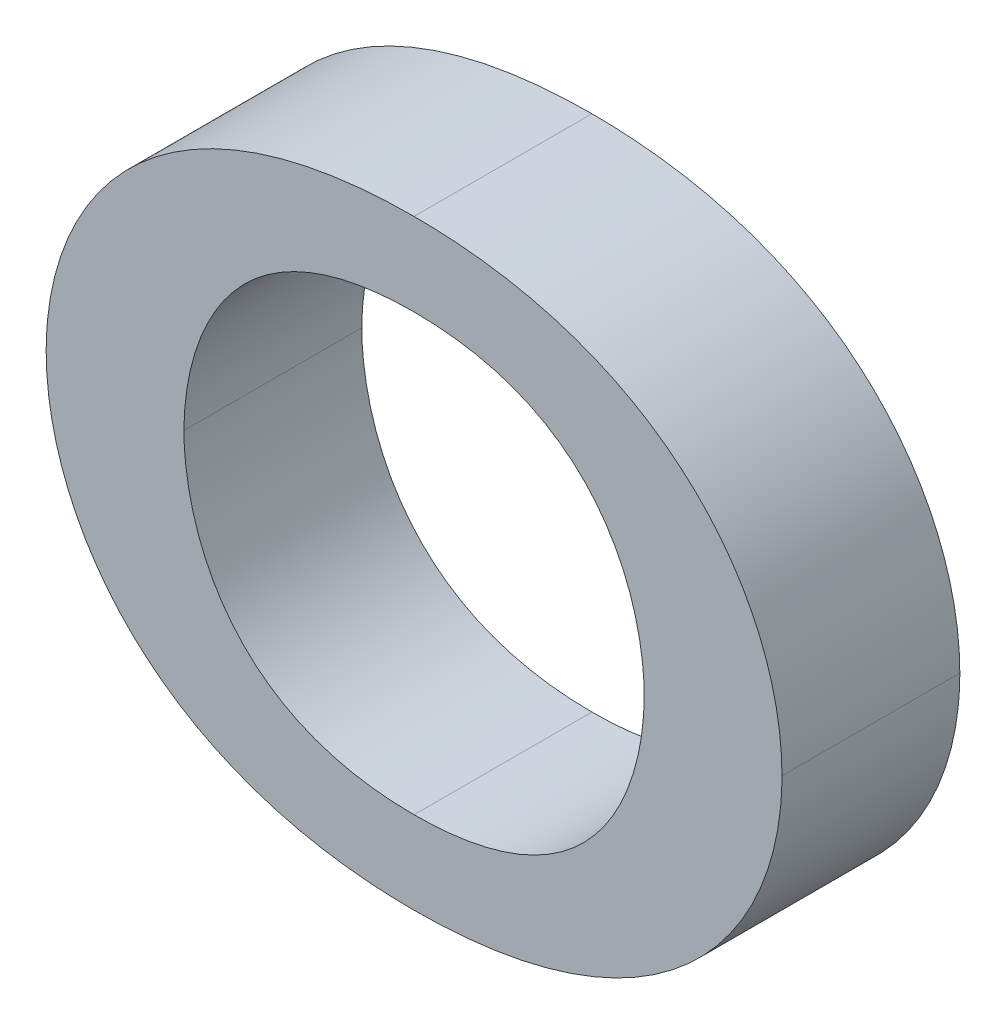
ISO-10303-21;
HEADER;
FILE_DESCRIPTION(('STEP AP214'),'2;1');
FILE_NAME('part.step','',(''),(''),'','','');
FILE_SCHEMA(('AUTOMOTIVE_DESIGN { 1 0 10303 214 1 1 1 1 }'));
ENDSEC;
DATA;
#1=APPLICATION_CONTEXT('core data for automotive mechanical design processes');
#2=APPLICATION_PROTOCOL_DEFINITION('international standard','automotive_design',2000,#1);
#3=PRODUCT_CONTEXT('',#1,'mechanical');
#4=PRODUCT('Part','Part','',(#3));
#5=PRODUCT_RELATED_PRODUCT_CATEGORY('part','',(#4));
#6=PRODUCT_DEFINITION_FORMATION('','',#4);
#7=PRODUCT_DEFINITION_CONTEXT('part definition',#1,'design');
#8=PRODUCT_DEFINITION('design','',#6,#7);
#9=PRODUCT_DEFINITION_SHAPE('','',#8);
#10=(LENGTH_UNIT() NAMED_UNIT(*) SI_UNIT(.MILLI.,.METRE.));
#11=(NAMED_UNIT(*) PLANE_ANGLE_UNIT() SI_UNIT($,.RADIAN.));
#12=(NAMED_UNIT(*) SI_UNIT($,.STERADIAN.) SOLID_ANGLE_UNIT());
#13=UNCERTAINTY_MEASURE_WITH_UNIT(LENGTH_MEASURE(1.E-05),#10,'distance_accuracy_value','');
#14=(GEOMETRIC_REPRESENTATION_CONTEXT(3) GLOBAL_UNCERTAINTY_ASSIGNED_CONTEXT((#13)) GLOBAL_UNIT_ASSIGNED_CONTEXT((#10,
#11,#12)) REPRESENTATION_CONTEXT('',''));
#15=CARTESIAN_POINT('',(0.,0.,0.));
#16=DIRECTION('',(0.,0.,1.));
#17=DIRECTION('',(1.,0.,0.));
#18=AXIS2_PLACEMENT_3D('',#15,#16,#17);
#19=CARTESIAN_POINT('',(-11.242747824746,-2.367797861412,-5.499));
#20=CARTESIAN_POINT('',(-11.242747824746,-2.367797861412,-6.501));
#21=CARTESIAN_POINT('',(-12.315409580301,-2.367797861412,-5.499));
#22=CARTESIAN_POINT('',(-12.315409580301,-2.367797861412,-6.501));
#23=CARTESIAN_POINT('',(-12.536649224746,-1.572100528079,-5.499));
#24=CARTESIAN_POINT('',(-12.536649224746,-1.572100528079,-6.501));
#25=CARTESIAN_POINT('',(-12.536649224746,-1.143704128079,-5.499));
#26=CARTESIAN_POINT('',(-12.536649224746,-1.143704128079,-6.501));
#27=(BOUNDED_SURFACE() B_SPLINE_SURFACE(3,1,((#19,#20),(#21,#22),(#23,#24),(#25,#26)),
.UNSPECIFIED.,.F.,.F.,.F.) B_SPLINE_SURFACE_WITH_KNOTS((4,4),(2,2),(0.,1.),(-1.001,0.001),
.UNSPECIFIED.) GEOMETRIC_REPRESENTATION_ITEM() RATIONAL_B_SPLINE_SURFACE(((1.,1.),(1.,1.),(1.,
1.),(1.,1.))) REPRESENTATION_ITEM('') SURFACE());
#28=DIRECTION('',(0.,0.,1.));
#29=VECTOR('',#28,1.);
#30=CARTESIAN_POINT('',(-11.242747824746,-2.367797861412,-6.5));
#31=LINE('',#30,#29);
#32=CARTESIAN_POINT('',(-11.242747824746,-2.367797861412,-6.5));
#33=VERTEX_POINT('',#32);
#34=CARTESIAN_POINT('',(-11.242747824746,-2.367797861412,-5.5));
#35=VERTEX_POINT('',#34);
#36=EDGE_CURVE('E118',#33,#35,#31,.T.);
#37=CARTESIAN_POINT('',(-11.242747824746,-2.367797861412,-6.5));
#38=CARTESIAN_POINT('',(-12.315409580301,-2.367797861412,-6.5));
#39=CARTESIAN_POINT('',(-12.536649224746,-1.572100528079,-6.5));
#40=CARTESIAN_POINT('',(-12.536649224746,-1.143704128079,-6.5));
#41=(BOUNDED_CURVE() B_SPLINE_CURVE(3,(#37,#38,#39,#40),.UNSPECIFIED.,.F.,
.F.) B_SPLINE_CURVE_WITH_KNOTS((4,4),(0.,1.),
.UNSPECIFIED.) CURVE() GEOMETRIC_REPRESENTATION_ITEM() RATIONAL_B_SPLINE_CURVE((1.,1.,1.,1.)) REPRESENTATION_ITEM(''));
#42=CARTESIAN_POINT('',(-12.536649224746,-1.143704128079,-6.5));
#43=VERTEX_POINT('',#42);
#44=EDGE_CURVE('E139',#33,#43,#41,.T.);
#45=DIRECTION('',(0.,0.,1.));
#46=VECTOR('',#45,1.);
#47=CARTESIAN_POINT('',(-12.536649224746,-1.143704128079,-6.5));
#48=LINE('',#47,#46);
#49=CARTESIAN_POINT('',(-12.536649224746,-1.143704128079,-5.5));
#50=VERTEX_POINT('',#49);
#51=EDGE_CURVE('E11',#43,#50,#48,.T.);
#52=CARTESIAN_POINT('',(-11.242747824746,-2.367797861412,-5.5));
#53=CARTESIAN_POINT('',(-12.315409580301,-2.367797861412,-5.5));
#54=CARTESIAN_POINT('',(-12.536649224746,-1.572100528079,-5.5));
#55=CARTESIAN_POINT('',(-12.536649224746,-1.143704128079,-5.5));
#56=(BOUNDED_CURVE() B_SPLINE_CURVE(3,(#52,#53,#54,#55),.UNSPECIFIED.,.F.,
.F.) B_SPLINE_CURVE_WITH_KNOTS((4,4),(0.,1.),
.UNSPECIFIED.) CURVE() GEOMETRIC_REPRESENTATION_ITEM() RATIONAL_B_SPLINE_CURVE((1.,1.,1.,1.)) REPRESENTATION_ITEM(''));
#57=EDGE_CURVE('E132',#35,#50,#56,.T.);
#58=ORIENTED_EDGE('',*,*,#36,.F.);
#59=ORIENTED_EDGE('',*,*,#44,.T.);
#60=ORIENTED_EDGE('',*,*,#51,.T.);
#61=ORIENTED_EDGE('',*,*,#57,.F.);
#62=EDGE_LOOP('',(#58,#59,#60,#61));
#63=FACE_BOUND('',#62,.T.);
#64=ADVANCED_FACE('F16',(#63),#27,.F.);
#65=CARTESIAN_POINT('',(-12.536649224746,-1.143704128079,-5.499));
#66=CARTESIAN_POINT('',(-12.536649224746,-1.143704128079,-6.501));
#67=CARTESIAN_POINT('',(-12.536649224746,-0.715369816968,-5.499));
#68=CARTESIAN_POINT('',(-12.536649224746,-0.715369816968,-6.501));
#69=CARTESIAN_POINT('',(-12.315409580301,0.0803275163660002,-5.499));
#70=CARTESIAN_POINT('',(-12.315409580301,0.0803275163660002,-6.501));
#71=CARTESIAN_POINT('',(-11.242747824746,0.0803275163660002,-5.499));
#72=CARTESIAN_POINT('',(-11.242747824746,0.0803275163660002,-6.501));
#73=(BOUNDED_SURFACE() B_SPLINE_SURFACE(3,1,((#65,#66),(#67,#68),(#69,#70),(#71,#72)),
.UNSPECIFIED.,.F.,.F.,.F.) B_SPLINE_SURFACE_WITH_KNOTS((4,4),(2,2),(0.,1.),(-1.001,0.001),
.UNSPECIFIED.) GEOMETRIC_REPRESENTATION_ITEM() RATIONAL_B_SPLINE_SURFACE(((1.,1.),(1.,1.),(1.,
1.),(1.,1.))) REPRESENTATION_ITEM('') SURFACE());
#74=CARTESIAN_POINT('',(-12.536649224746,-1.143704128079,-6.5));
#75=CARTESIAN_POINT('',(-12.536649224746,-0.715369816968,-6.5));
#76=CARTESIAN_POINT('',(-12.315409580301,0.0803275163660002,-6.5));
#77=CARTESIAN_POINT('',(-11.242747824746,0.0803275163660002,-6.5));
#78=(BOUNDED_CURVE() B_SPLINE_CURVE(3,(#74,#75,#76,#77),.UNSPECIFIED.,.F.,
.F.) B_SPLINE_CURVE_WITH_KNOTS((4,4),(0.,1.),
.UNSPECIFIED.) CURVE() GEOMETRIC_REPRESENTATION_ITEM() RATIONAL_B_SPLINE_CURVE((1.,1.,1.,1.)) REPRESENTATION_ITEM(''));
#79=CARTESIAN_POINT('',(-11.242747824746,0.0803275163660002,-6.5));
#80=VERTEX_POINT('',#79);
#81=EDGE_CURVE('E200',#43,#80,#78,.T.);
#82=DIRECTION('',(0.,0.,1.));
#83=VECTOR('',#82,1.);
#84=CARTESIAN_POINT('',(-11.242747824746,0.0803275163660002,-6.5));
#85=LINE('',#84,#83);
#86=CARTESIAN_POINT('',(-11.242747824746,0.0803275163660002,-5.5));
#87=VERTEX_POINT('',#86);
#88=EDGE_CURVE('E31',#80,#87,#85,.T.);
#89=CARTESIAN_POINT('',(-12.536649224746,-1.143704128079,-5.5));
#90=CARTESIAN_POINT('',(-12.536649224746,-0.715369816968,-5.5));
#91=CARTESIAN_POINT('',(-12.315409580301,0.0803275163660002,-5.5));
#92=CARTESIAN_POINT('',(-11.242747824746,0.0803275163660002,-5.5));
#93=(BOUNDED_CURVE() B_SPLINE_CURVE(3,(#89,#90,#91,#92),.UNSPECIFIED.,.F.,
.F.) B_SPLINE_CURVE_WITH_KNOTS((4,4),(0.,1.),
.UNSPECIFIED.) CURVE() GEOMETRIC_REPRESENTATION_ITEM() RATIONAL_B_SPLINE_CURVE((1.,1.,1.,1.)) REPRESENTATION_ITEM(''));
#94=EDGE_CURVE('E125',#50,#87,#93,.T.);
#95=ORIENTED_EDGE('',*,*,#51,.F.);
#96=ORIENTED_EDGE('',*,*,#81,.T.);
#97=ORIENTED_EDGE('',*,*,#88,.T.);
#98=ORIENTED_EDGE('',*,*,#94,.F.);
#99=EDGE_LOOP('',(#95,#96,#97,#98));
#100=FACE_BOUND('',#99,.T.);
#101=ADVANCED_FACE('F285',(#100),#73,.F.);
#102=CARTESIAN_POINT('',(-11.242747824746,0.0803275163660002,-5.499));
#103=CARTESIAN_POINT('',(-11.242747824746,0.0803275163660002,-6.501));
#104=CARTESIAN_POINT('',(-10.170105824746,0.0803275163660002,-5.499));
#105=CARTESIAN_POINT('',(-10.170105824746,0.0803275163660002,-6.501));
#106=CARTESIAN_POINT('',(-9.948606535857,-0.715369816968,-5.499));
#107=CARTESIAN_POINT('',(-9.948606535857,-0.715369816968,-6.501));
#108=CARTESIAN_POINT('',(-9.948606535857,-1.143704128079,-5.499));
#109=CARTESIAN_POINT('',(-9.948606535857,-1.143704128079,-6.501));
#110=(BOUNDED_SURFACE() B_SPLINE_SURFACE(3,1,((#102,#103),(#104,#105),(#106,#107),(#108,#109)),
.UNSPECIFIED.,.F.,.F.,.F.) B_SPLINE_SURFACE_WITH_KNOTS((4,4),(2,2),(0.,1.),(-1.001,0.001),
.UNSPECIFIED.) GEOMETRIC_REPRESENTATION_ITEM() RATIONAL_B_SPLINE_SURFACE(((1.,1.),(1.,1.),(1.,
1.),(1.,1.))) REPRESENTATION_ITEM('') SURFACE());
#111=CARTESIAN_POINT('',(-11.242747824746,0.0803275163660002,-6.5));
#112=CARTESIAN_POINT('',(-10.170105824746,0.0803275163660002,-6.5));
#113=CARTESIAN_POINT('',(-9.948606535857,-0.715369816968,-6.5));
#114=CARTESIAN_POINT('',(-9.948606535857,-1.143704128079,-6.5));
#115=(BOUNDED_CURVE() B_SPLINE_CURVE(3,(#111,#112,#113,#114),.UNSPECIFIED.,.F.,
.F.) B_SPLINE_CURVE_WITH_KNOTS((4,4),(0.,1.),
.UNSPECIFIED.) CURVE() GEOMETRIC_REPRESENTATION_ITEM() RATIONAL_B_SPLINE_CURVE((1.,1.,1.,1.)) REPRESENTATION_ITEM(''));
#116=CARTESIAN_POINT('',(-9.948606535857,-1.143704128079,-6.5));
#117=VERTEX_POINT('',#116);
#118=EDGE_CURVE('E112',#80,#117,#115,.T.);
#119=DIRECTION('',(0.,0.,1.));
#120=VECTOR('',#119,1.);
#121=CARTESIAN_POINT('',(-9.948606535857,-1.143704128079,-6.5));
#122=LINE('',#121,#120);
#123=CARTESIAN_POINT('',(-9.948606535857,-1.143704128079,-5.5));
#124=VERTEX_POINT('',#123);
#125=EDGE_CURVE('E106',#117,#124,#122,.T.);
#126=CARTESIAN_POINT('',(-11.242747824746,0.0803275163660002,-5.5));
#127=CARTESIAN_POINT('',(-10.170105824746,0.0803275163660002,-5.5));
#128=CARTESIAN_POINT('',(-9.948606535857,-0.715369816968,-5.5));
#129=CARTESIAN_POINT('',(-9.948606535857,-1.143704128079,-5.5));
#130=(BOUNDED_CURVE() B_SPLINE_CURVE(3,(#126,#127,#128,#129),.UNSPECIFIED.,.F.,
.F.) B_SPLINE_CURVE_WITH_KNOTS((4,4),(0.,1.),
.UNSPECIFIED.) CURVE() GEOMETRIC_REPRESENTATION_ITEM() RATIONAL_B_SPLINE_CURVE((1.,1.,1.,1.)) REPRESENTATION_ITEM(''));
#131=EDGE_CURVE('E109',#87,#124,#130,.T.);
#132=ORIENTED_EDGE('',*,*,#88,.F.);
#133=ORIENTED_EDGE('',*,*,#118,.T.);
#134=ORIENTED_EDGE('',*,*,#125,.T.);
#135=ORIENTED_EDGE('',*,*,#131,.F.);
#136=EDGE_LOOP('',(#132,#133,#134,#135));
#137=FACE_BOUND('',#136,.T.);
#138=ADVANCED_FACE('F108',(#137),#110,.F.);
#139=CARTESIAN_POINT('',(-9.948606535857,-1.143704128079,-5.499));
#140=CARTESIAN_POINT('',(-9.948606535857,-1.143704128079,-6.501));
#141=CARTESIAN_POINT('',(-9.948606535857,-1.572100528079,-5.499));
#142=CARTESIAN_POINT('',(-9.948606535857,-1.572100528079,-6.501));
#143=CARTESIAN_POINT('',(-10.170103002523,-2.367797861412,-5.499));
#144=CARTESIAN_POINT('',(-10.170103002523,-2.367797861412,-6.501));
#145=CARTESIAN_POINT('',(-11.242747824746,-2.367797861412,-5.499));
#146=CARTESIAN_POINT('',(-11.242747824746,-2.367797861412,-6.501));
#147=(BOUNDED_SURFACE() B_SPLINE_SURFACE(3,1,((#139,#140),(#141,#142),(#143,#144),(#145,#146)),
.UNSPECIFIED.,.F.,.F.,.F.) B_SPLINE_SURFACE_WITH_KNOTS((4,4),(2,2),(0.,1.),(-1.001,0.001),
.UNSPECIFIED.) GEOMETRIC_REPRESENTATION_ITEM() RATIONAL_B_SPLINE_SURFACE(((1.,1.),(1.,1.),(1.,
1.),(1.,1.))) REPRESENTATION_ITEM('') SURFACE());
#148=CARTESIAN_POINT('',(-9.948606535857,-1.143704128079,-6.5));
#149=CARTESIAN_POINT('',(-9.948606535857,-1.572100528079,-6.5));
#150=CARTESIAN_POINT('',(-10.170103002523,-2.367797861412,-6.5));
#151=CARTESIAN_POINT('',(-11.242747824746,-2.367797861412,-6.5));
#152=(BOUNDED_CURVE() B_SPLINE_CURVE(3,(#148,#149,#150,#151),.UNSPECIFIED.,.F.,
.F.) B_SPLINE_CURVE_WITH_KNOTS((4,4),(0.,1.),
.UNSPECIFIED.) CURVE() GEOMETRIC_REPRESENTATION_ITEM() RATIONAL_B_SPLINE_CURVE((1.,1.,1.,1.)) REPRESENTATION_ITEM(''));
#153=EDGE_CURVE('E182',#117,#33,#152,.T.);
#154=CARTESIAN_POINT('',(-9.948606535857,-1.143704128079,-5.5));
#155=CARTESIAN_POINT('',(-9.948606535857,-1.572100528079,-5.5));
#156=CARTESIAN_POINT('',(-10.170103002523,-2.367797861412,-5.5));
#157=CARTESIAN_POINT('',(-11.242747824746,-2.367797861412,-5.5));
#158=(BOUNDED_CURVE() B_SPLINE_CURVE(3,(#154,#155,#156,#157),.UNSPECIFIED.,.F.,
.F.) B_SPLINE_CURVE_WITH_KNOTS((4,4),(0.,1.),
.UNSPECIFIED.) CURVE() GEOMETRIC_REPRESENTATION_ITEM() RATIONAL_B_SPLINE_CURVE((1.,1.,1.,1.)) REPRESENTATION_ITEM(''));
#159=EDGE_CURVE('E124',#124,#35,#158,.T.);
#160=ORIENTED_EDGE('',*,*,#125,.F.);
#161=ORIENTED_EDGE('',*,*,#153,.T.);
#162=ORIENTED_EDGE('',*,*,#36,.T.);
#163=ORIENTED_EDGE('',*,*,#159,.F.);
#164=EDGE_LOOP('',(#160,#161,#162,#163));
#165=FACE_BOUND('',#164,.T.);
#166=ADVANCED_FACE('F128',(#165),#147,.F.);
#167=CARTESIAN_POINT('',(-11.242747824746,-2.832880328079,-5.499));
#168=CARTESIAN_POINT('',(-11.242747824746,-2.832880328079,-6.501));
#169=CARTESIAN_POINT('',(-9.821081602523,-2.832880328079,-5.499));
#170=CARTESIAN_POINT('',(-9.821081602523,-2.832880328079,-6.501));
#171=CARTESIAN_POINT('',(-9.174070224746,-1.969881461412,-5.499));
#172=CARTESIAN_POINT('',(-9.174070224746,-1.969881461412,-6.501));
#173=CARTESIAN_POINT('',(-9.174070224746,-1.143704128079,-5.499));
#174=CARTESIAN_POINT('',(-9.174070224746,-1.143704128079,-6.501));
#175=(BOUNDED_SURFACE() B_SPLINE_SURFACE(3,1,((#167,#168),(#169,#170),(#171,#172),(#173,#174)),
.UNSPECIFIED.,.F.,.F.,.F.) B_SPLINE_SURFACE_WITH_KNOTS((4,4),(2,2),(0.,1.),(-1.001,0.001),
.UNSPECIFIED.) GEOMETRIC_REPRESENTATION_ITEM() RATIONAL_B_SPLINE_SURFACE(((1.,1.),(1.,1.),(1.,
1.),(1.,1.))) REPRESENTATION_ITEM('') SURFACE());
#176=DIRECTION('',(0.,0.,1.));
#177=VECTOR('',#176,1.);
#178=CARTESIAN_POINT('',(-11.242747824746,-2.832880328079,-6.5));
#179=LINE('',#178,#177);
#180=CARTESIAN_POINT('',(-11.242747824746,-2.832880328079,-6.5));
#181=VERTEX_POINT('',#180);
#182=CARTESIAN_POINT('',(-11.242747824746,-2.832880328079,-5.5));
#183=VERTEX_POINT('',#182);
#184=EDGE_CURVE('E174',#181,#183,#179,.T.);
#185=CARTESIAN_POINT('',(-11.242747824746,-2.832880328079,-6.5));
#186=CARTESIAN_POINT('',(-9.821081602523,-2.832880328079,-6.5));
#187=CARTESIAN_POINT('',(-9.174070224746,-1.969881461412,-6.5));
#188=CARTESIAN_POINT('',(-9.174070224746,-1.143704128079,-6.5));
#189=(BOUNDED_CURVE() B_SPLINE_CURVE(3,(#185,#186,#187,#188),.UNSPECIFIED.,.F.,
.F.) B_SPLINE_CURVE_WITH_KNOTS((4,4),(0.,1.),
.UNSPECIFIED.) CURVE() GEOMETRIC_REPRESENTATION_ITEM() RATIONAL_B_SPLINE_CURVE((1.,1.,1.,1.)) REPRESENTATION_ITEM(''));
#190=CARTESIAN_POINT('',(-9.174070224746,-1.143704128079,-6.5));
#191=VERTEX_POINT('',#190);
#192=EDGE_CURVE('E22',#181,#191,#189,.T.);
#193=DIRECTION('',(0.,0.,1.));
#194=VECTOR('',#193,1.);
#195=CARTESIAN_POINT('',(-9.174070224746,-1.143704128079,-6.5));
#196=LINE('',#195,#194);
#197=CARTESIAN_POINT('',(-9.174070224746,-1.143704128079,-5.5));
#198=VERTEX_POINT('',#197);
#199=EDGE_CURVE('E172',#191,#198,#196,.T.);
#200=CARTESIAN_POINT('',(-11.242747824746,-2.832880328079,-5.5));
#201=CARTESIAN_POINT('',(-9.821081602523,-2.832880328079,-5.5));
#202=CARTESIAN_POINT('',(-9.174070224746,-1.969881461412,-5.5));
#203=CARTESIAN_POINT('',(-9.174070224746,-1.143704128079,-5.5));
#204=(BOUNDED_CURVE() B_SPLINE_CURVE(3,(#200,#201,#202,#203),.UNSPECIFIED.,.F.,
.F.) B_SPLINE_CURVE_WITH_KNOTS((4,4),(0.,1.),
.UNSPECIFIED.) CURVE() GEOMETRIC_REPRESENTATION_ITEM() RATIONAL_B_SPLINE_CURVE((1.,1.,1.,1.)) REPRESENTATION_ITEM(''));
#205=EDGE_CURVE('E79',#183,#198,#204,.T.);
#206=ORIENTED_EDGE('',*,*,#184,.F.);
#207=ORIENTED_EDGE('',*,*,#192,.T.);
#208=ORIENTED_EDGE('',*,*,#199,.T.);
#209=ORIENTED_EDGE('',*,*,#205,.F.);
#210=EDGE_LOOP('',(#206,#207,#208,#209));
#211=FACE_BOUND('',#210,.T.);
#212=ADVANCED_FACE('F326',(#211),#175,.F.);
#213=CARTESIAN_POINT('',(-11.242657912226,-1.14372778366,-5.5));
#214=DIRECTION('',(0.,0.,1.));
#215=DIRECTION('',(0.,-1.,0.));
#216=AXIS2_PLACEMENT_3D('',#213,#214,#215);
#217=PLANE('',#216);
#218=ORIENTED_EDGE('',*,*,#159,.T.);
#219=ORIENTED_EDGE('',*,*,#57,.T.);
#220=ORIENTED_EDGE('',*,*,#94,.T.);
#221=ORIENTED_EDGE('',*,*,#131,.T.);
#222=EDGE_LOOP('',(#218,#219,#220,#221));
#223=FACE_BOUND('',#222,.T.);
#224=CARTESIAN_POINT('',(-11.242747824746,0.545409983032,-5.5));
#225=CARTESIAN_POINT('',(-12.664430980301,0.545409983032,-5.5));
#226=CARTESIAN_POINT('',(-13.311171424746,-0.317453416968,-5.5));
#227=CARTESIAN_POINT('',(-13.311171424746,-1.143704128079,-5.5));
#228=(BOUNDED_CURVE() B_SPLINE_CURVE(3,(#224,#225,#226,#227),.UNSPECIFIED.,.F.,
.F.) B_SPLINE_CURVE_WITH_KNOTS((4,4),(0.,1.),
.UNSPECIFIED.) CURVE() GEOMETRIC_REPRESENTATION_ITEM() RATIONAL_B_SPLINE_CURVE((1.,1.,1.,1.)) REPRESENTATION_ITEM(''));
#229=CARTESIAN_POINT('',(-11.242747824746,0.545409983032,-5.5));
#230=VERTEX_POINT('',#229);
#231=CARTESIAN_POINT('',(-13.311171424746,-1.143704128079,-5.5));
#232=VERTEX_POINT('',#231);
#233=EDGE_CURVE('E163',#230,#232,#228,.T.);
#234=ORIENTED_EDGE('',*,*,#233,.T.);
#235=CARTESIAN_POINT('',(-13.311171424746,-1.143704128079,-5.5));
#236=CARTESIAN_POINT('',(-13.311171424746,-1.96987863919,-5.5));
#237=CARTESIAN_POINT('',(-12.664430980301,-2.832880328079,-5.5));
#238=CARTESIAN_POINT('',(-11.242747824746,-2.832880328079,-5.5));
#239=(BOUNDED_CURVE() B_SPLINE_CURVE(3,(#235,#236,#237,#238),.UNSPECIFIED.,.F.,
.F.) B_SPLINE_CURVE_WITH_KNOTS((4,4),(0.,1.),
.UNSPECIFIED.) CURVE() GEOMETRIC_REPRESENTATION_ITEM() RATIONAL_B_SPLINE_CURVE((1.,1.,1.,1.)) REPRESENTATION_ITEM(''));
#240=EDGE_CURVE('E181',#232,#183,#239,.T.);
#241=ORIENTED_EDGE('',*,*,#240,.T.);
#242=ORIENTED_EDGE('',*,*,#205,.T.);
#243=CARTESIAN_POINT('',(-9.174070224746,-1.143704128079,-5.5));
#244=CARTESIAN_POINT('',(-9.174070224746,-0.317453416968,-5.5));
#245=CARTESIAN_POINT('',(-9.821081602523,0.545409983032,-5.5));
#246=CARTESIAN_POINT('',(-11.242747824746,0.545409983032,-5.5));
#247=(BOUNDED_CURVE() B_SPLINE_CURVE(3,(#243,#244,#245,#246),.UNSPECIFIED.,.F.,
.F.) B_SPLINE_CURVE_WITH_KNOTS((4,4),(0.,1.),
.UNSPECIFIED.) CURVE() GEOMETRIC_REPRESENTATION_ITEM() RATIONAL_B_SPLINE_CURVE((1.,1.,1.,1.)) REPRESENTATION_ITEM(''));
#248=EDGE_CURVE('E153',#198,#230,#247,.T.);
#249=ORIENTED_EDGE('',*,*,#248,.T.);
#250=EDGE_LOOP('',(#234,#241,#242,#249));
#251=FACE_BOUND('',#250,.T.);
#252=ADVANCED_FACE('F122',(#223,#251),#217,.T.);
#253=CARTESIAN_POINT('',(-11.242657912226,-1.14372778366,-6.5));
#254=DIRECTION('',(0.,0.,1.));
#255=DIRECTION('',(0.,-1.,0.));
#256=AXIS2_PLACEMENT_3D('',#253,#254,#255);
#257=PLANE('',#256);
#258=ORIENTED_EDGE('',*,*,#153,.F.);
#259=ORIENTED_EDGE('',*,*,#118,.F.);
#260=ORIENTED_EDGE('',*,*,#81,.F.);
#261=ORIENTED_EDGE('',*,*,#44,.F.);
#262=EDGE_LOOP('',(#258,#259,#260,#261));
#263=FACE_BOUND('',#262,.T.);
#264=CARTESIAN_POINT('',(-11.242747824746,0.545409983032,-6.5));
#265=CARTESIAN_POINT('',(-12.664430980301,0.545409983032,-6.5));
#266=CARTESIAN_POINT('',(-13.311171424746,-0.317453416968,-6.5));
#267=CARTESIAN_POINT('',(-13.311171424746,-1.143704128079,-6.5));
#268=(BOUNDED_CURVE() B_SPLINE_CURVE(3,(#264,#265,#266,#267),.UNSPECIFIED.,.F.,
.F.) B_SPLINE_CURVE_WITH_KNOTS((4,4),(0.,1.),
.UNSPECIFIED.) CURVE() GEOMETRIC_REPRESENTATION_ITEM() RATIONAL_B_SPLINE_CURVE((1.,1.,1.,1.)) REPRESENTATION_ITEM(''));
#269=CARTESIAN_POINT('',(-11.242747824746,0.545409983032,-6.5));
#270=VERTEX_POINT('',#269);
#271=CARTESIAN_POINT('',(-13.311171424746,-1.143704128079,-6.5));
#272=VERTEX_POINT('',#271);
#273=EDGE_CURVE('E201',#270,#272,#268,.T.);
#274=ORIENTED_EDGE('',*,*,#273,.F.);
#275=CARTESIAN_POINT('',(-9.174070224746,-1.143704128079,-6.5));
#276=CARTESIAN_POINT('',(-9.174070224746,-0.317453416968,-6.5));
#277=CARTESIAN_POINT('',(-9.821081602523,0.545409983032,-6.5));
#278=CARTESIAN_POINT('',(-11.242747824746,0.545409983032,-6.5));
#279=(BOUNDED_CURVE() B_SPLINE_CURVE(3,(#275,#276,#277,#278),.UNSPECIFIED.,.F.,
.F.) B_SPLINE_CURVE_WITH_KNOTS((4,4),(0.,1.),
.UNSPECIFIED.) CURVE() GEOMETRIC_REPRESENTATION_ITEM() RATIONAL_B_SPLINE_CURVE((1.,1.,1.,1.)) REPRESENTATION_ITEM(''));
#280=EDGE_CURVE('E162',#191,#270,#279,.T.);
#281=ORIENTED_EDGE('',*,*,#280,.F.);
#282=ORIENTED_EDGE('',*,*,#192,.F.);
#283=CARTESIAN_POINT('',(-13.311171424746,-1.143704128079,-6.5));
#284=CARTESIAN_POINT('',(-13.311171424746,-1.96987863919,-6.5));
#285=CARTESIAN_POINT('',(-12.664430980301,-2.832880328079,-6.5));
#286=CARTESIAN_POINT('',(-11.242747824746,-2.832880328079,-6.5));
#287=(BOUNDED_CURVE() B_SPLINE_CURVE(3,(#283,#284,#285,#286),.UNSPECIFIED.,.F.,
.F.) B_SPLINE_CURVE_WITH_KNOTS((4,4),(0.,1.),
.UNSPECIFIED.) CURVE() GEOMETRIC_REPRESENTATION_ITEM() RATIONAL_B_SPLINE_CURVE((1.,1.,1.,1.)) REPRESENTATION_ITEM(''));
#288=EDGE_CURVE('E161',#272,#181,#287,.T.);
#289=ORIENTED_EDGE('',*,*,#288,.F.);
#290=EDGE_LOOP('',(#274,#281,#282,#289));
#291=FACE_BOUND('',#290,.T.);
#292=ADVANCED_FACE('F260',(#263,#291),#257,.F.);
#293=CARTESIAN_POINT('',(-13.311171424746,-1.143704128079,-5.499));
#294=CARTESIAN_POINT('',(-13.311171424746,-1.143704128079,-6.501));
#295=CARTESIAN_POINT('',(-13.311171424746,-1.96987863919,-5.499));
#296=CARTESIAN_POINT('',(-13.311171424746,-1.96987863919,-6.501));
#297=CARTESIAN_POINT('',(-12.664430980301,-2.832880328079,-5.499));
#298=CARTESIAN_POINT('',(-12.664430980301,-2.832880328079,-6.501));
#299=CARTESIAN_POINT('',(-11.242747824746,-2.832880328079,-5.499));
#300=CARTESIAN_POINT('',(-11.242747824746,-2.832880328079,-6.501));
#301=(BOUNDED_SURFACE() B_SPLINE_SURFACE(3,1,((#293,#294),(#295,#296),(#297,#298),(#299,#300)),
.UNSPECIFIED.,.F.,.F.,.F.) B_SPLINE_SURFACE_WITH_KNOTS((4,4),(2,2),(0.,1.),(-1.001,0.001),
.UNSPECIFIED.) GEOMETRIC_REPRESENTATION_ITEM() RATIONAL_B_SPLINE_SURFACE(((1.,1.),(1.,1.),(1.,
1.),(1.,1.))) REPRESENTATION_ITEM('') SURFACE());
#302=DIRECTION('',(0.,0.,1.));
#303=VECTOR('',#302,1.);
#304=CARTESIAN_POINT('',(-13.311171424746,-1.143704128079,-6.5));
#305=LINE('',#304,#303);
#306=EDGE_CURVE('E173',#272,#232,#305,.T.);
#307=ORIENTED_EDGE('',*,*,#306,.F.);
#308=ORIENTED_EDGE('',*,*,#288,.T.);
#309=ORIENTED_EDGE('',*,*,#184,.T.);
#310=ORIENTED_EDGE('',*,*,#240,.F.);
#311=EDGE_LOOP('',(#307,#308,#309,#310));
#312=FACE_BOUND('',#311,.T.);
#313=ADVANCED_FACE('F258',(#312),#301,.F.);
#314=CARTESIAN_POINT('',(-9.174070224746,-1.143704128079,-5.499));
#315=CARTESIAN_POINT('',(-9.174070224746,-1.143704128079,-6.501));
#316=CARTESIAN_POINT('',(-9.174070224746,-0.317453416968,-5.499));
#317=CARTESIAN_POINT('',(-9.174070224746,-0.317453416968,-6.501));
#318=CARTESIAN_POINT('',(-9.821081602523,0.545409983032,-5.499));
#319=CARTESIAN_POINT('',(-9.821081602523,0.545409983032,-6.501));
#320=CARTESIAN_POINT('',(-11.242747824746,0.545409983032,-5.499));
#321=CARTESIAN_POINT('',(-11.242747824746,0.545409983032,-6.501));
#322=(BOUNDED_SURFACE() B_SPLINE_SURFACE(3,1,((#314,#315),(#316,#317),(#318,#319),(#320,#321)),
.UNSPECIFIED.,.F.,.F.,.F.) B_SPLINE_SURFACE_WITH_KNOTS((4,4),(2,2),(0.,1.),(-1.001,0.001),
.UNSPECIFIED.) GEOMETRIC_REPRESENTATION_ITEM() RATIONAL_B_SPLINE_SURFACE(((1.,1.),(1.,1.),(1.,
1.),(1.,1.))) REPRESENTATION_ITEM('') SURFACE());
#323=DIRECTION('',(0.,0.,1.));
#324=VECTOR('',#323,1.);
#325=CARTESIAN_POINT('',(-11.242747824746,0.545409983032,-6.5));
#326=LINE('',#325,#324);
#327=EDGE_CURVE('E210',#270,#230,#326,.T.);
#328=ORIENTED_EDGE('',*,*,#199,.F.);
#329=ORIENTED_EDGE('',*,*,#280,.T.);
#330=ORIENTED_EDGE('',*,*,#327,.T.);
#331=ORIENTED_EDGE('',*,*,#248,.F.);
#332=EDGE_LOOP('',(#328,#329,#330,#331));
#333=FACE_BOUND('',#332,.T.);
#334=ADVANCED_FACE('F18',(#333),#322,.F.);
#335=CARTESIAN_POINT('',(-11.242747824746,0.545409983032,-5.499));
#336=CARTESIAN_POINT('',(-11.242747824746,0.545409983032,-6.501));
#337=CARTESIAN_POINT('',(-12.664430980301,0.545409983032,-5.499));
#338=CARTESIAN_POINT('',(-12.664430980301,0.545409983032,-6.501));
#339=CARTESIAN_POINT('',(-13.311171424746,-0.317453416968,-5.499));
#340=CARTESIAN_POINT('',(-13.311171424746,-0.317453416968,-6.501));
#341=CARTESIAN_POINT('',(-13.311171424746,-1.143704128079,-5.499));
#342=CARTESIAN_POINT('',(-13.311171424746,-1.143704128079,-6.501));
#343=(BOUNDED_SURFACE() B_SPLINE_SURFACE(3,1,((#335,#336),(#337,#338),(#339,#340),(#341,#342)),
.UNSPECIFIED.,.F.,.F.,.F.) B_SPLINE_SURFACE_WITH_KNOTS((4,4),(2,2),(0.,1.),(-1.001,0.001),
.UNSPECIFIED.) GEOMETRIC_REPRESENTATION_ITEM() RATIONAL_B_SPLINE_SURFACE(((1.,1.),(1.,1.),(1.,
1.),(1.,1.))) REPRESENTATION_ITEM('') SURFACE());
#344=ORIENTED_EDGE('',*,*,#327,.F.);
#345=ORIENTED_EDGE('',*,*,#273,.T.);
#346=ORIENTED_EDGE('',*,*,#306,.T.);
#347=ORIENTED_EDGE('',*,*,#233,.F.);
#348=EDGE_LOOP('',(#344,#345,#346,#347));
#349=FACE_BOUND('',#348,.T.);
#350=ADVANCED_FACE('F264',(#349),#343,.F.);
#351=CLOSED_SHELL('',(#64,#101,#138,#166,#212,#252,#292,#313,#334,#350));
#352=MANIFOLD_SOLID_BREP('B1',#351);
#353=ADVANCED_BREP_SHAPE_REPRESENTATION('',(#18,#352),#14);
#354=SHAPE_DEFINITION_REPRESENTATION(#9,#353);
ENDSEC;
END-ISO-10303-21;
